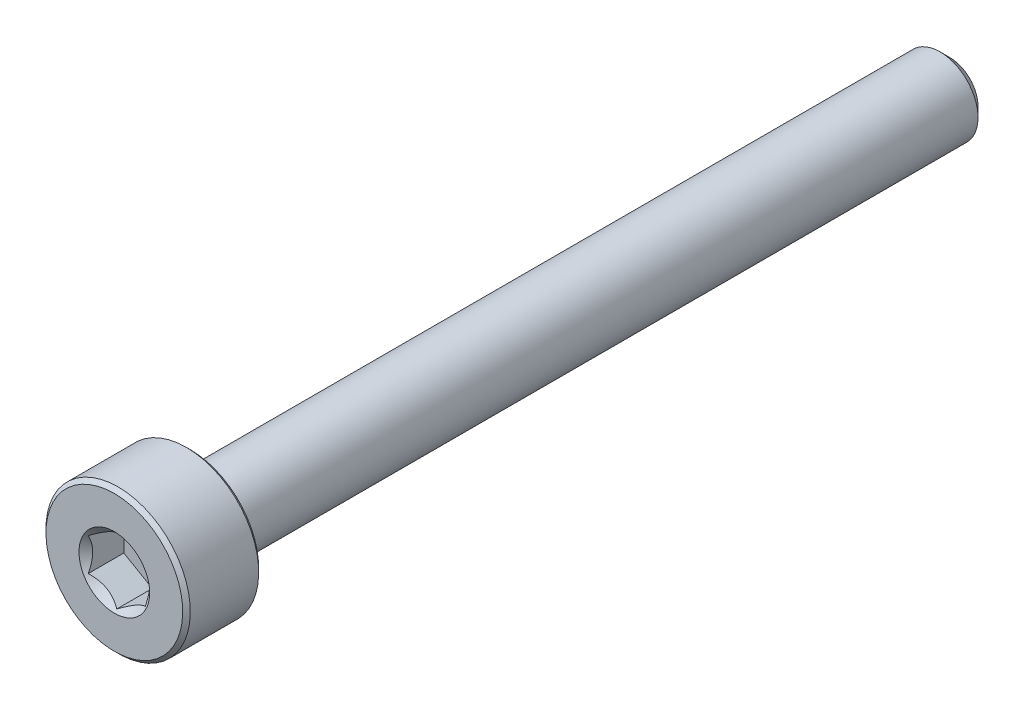
ISO-10303-21;
HEADER;
FILE_DESCRIPTION(('STEP AP214'),'2;1');
FILE_NAME('part.step','',(''),(''),'','','');
FILE_SCHEMA(('AUTOMOTIVE_DESIGN { 1 0 10303 214 1 1 1 1 }'));
ENDSEC;
DATA;
#1=APPLICATION_CONTEXT('core data for automotive mechanical design processes');
#2=APPLICATION_PROTOCOL_DEFINITION('international standard','automotive_design',2000,#1);
#3=PRODUCT_CONTEXT('',#1,'mechanical');
#4=PRODUCT('Part','Part','',(#3));
#5=PRODUCT_RELATED_PRODUCT_CATEGORY('part','',(#4));
#6=PRODUCT_DEFINITION_FORMATION('','',#4);
#7=PRODUCT_DEFINITION_CONTEXT('part definition',#1,'design');
#8=PRODUCT_DEFINITION('design','',#6,#7);
#9=PRODUCT_DEFINITION_SHAPE('','',#8);
#10=(LENGTH_UNIT() NAMED_UNIT(*) SI_UNIT(.MILLI.,.METRE.));
#11=(NAMED_UNIT(*) PLANE_ANGLE_UNIT() SI_UNIT($,.RADIAN.));
#12=(NAMED_UNIT(*) SI_UNIT($,.STERADIAN.) SOLID_ANGLE_UNIT());
#13=UNCERTAINTY_MEASURE_WITH_UNIT(LENGTH_MEASURE(1.E-05),#10,'distance_accuracy_value','');
#14=(GEOMETRIC_REPRESENTATION_CONTEXT(3) GLOBAL_UNCERTAINTY_ASSIGNED_CONTEXT((#13)) GLOBAL_UNIT_ASSIGNED_CONTEXT((#10,
#11,#12)) REPRESENTATION_CONTEXT('',''));
#15=CARTESIAN_POINT('',(0.,0.,0.));
#16=DIRECTION('',(0.,0.,1.));
#17=DIRECTION('',(1.,0.,0.));
#18=AXIS2_PLACEMENT_3D('',#15,#16,#17);
#19=CARTESIAN_POINT('',(0.,0.740192378864668,-11.));
#20=DIRECTION('',(0.,0.,-1.));
#21=DIRECTION('',(0.,1.,0.));
#22=AXIS2_PLACEMENT_3D('',#19,#20,#21);
#23=PLANE('',#22);
#24=CARTESIAN_POINT('',(0.,0.,-11.));
#25=DIRECTION('',(0.,0.,-1.));
#26=DIRECTION('',(0.,1.,0.));
#27=AXIS2_PLACEMENT_3D('',#24,#25,#26);
#28=CIRCLE('',#27,0.740192378864668);
#29=CARTESIAN_POINT('',(0.,0.740192378864668,-11.));
#30=VERTEX_POINT('',#29);
#31=EDGE_CURVE('E59',#30,#30,#28,.T.);
#32=ORIENTED_EDGE('',*,*,#31,.T.);
#33=EDGE_LOOP('',(#32));
#34=FACE_BOUND('',#33,.T.);
#35=ADVANCED_FACE('F45',(#34),#23,.T.);
#36=CARTESIAN_POINT('',(0.,0.,-11.));
#37=DIRECTION('',(0.,0.,1.));
#38=DIRECTION('',(0.,-1.,0.));
#39=AXIS2_PLACEMENT_3D('',#36,#37,#38);
#40=CONICAL_SURFACE('',#39,0.740192378864668,0.785398163397445);
#41=CARTESIAN_POINT('',(0.,0.,-10.7401923788647));
#42=DIRECTION('',(0.,0.,-1.));
#43=DIRECTION('',(0.,1.,0.));
#44=AXIS2_PLACEMENT_3D('',#41,#42,#43);
#45=CIRCLE('',#44,1.);
#46=CARTESIAN_POINT('',(0.,1.,-10.7401923788647));
#47=VERTEX_POINT('',#46);
#48=EDGE_CURVE('E177',#47,#47,#45,.T.);
#49=ORIENTED_EDGE('',*,*,#48,.T.);
#50=EDGE_LOOP('',(#49));
#51=FACE_BOUND('',#50,.T.);
#52=ORIENTED_EDGE('',*,*,#31,.F.);
#53=EDGE_LOOP('',(#52));
#54=FACE_BOUND('',#53,.T.);
#55=ADVANCED_FACE('F185',(#51,#54),#40,.T.);
#56=CARTESIAN_POINT('',(0.,0.,-11.));
#57=DIRECTION('',(0.,0.,-1.));
#58=DIRECTION('',(0.,1.,0.));
#59=AXIS2_PLACEMENT_3D('',#56,#57,#58);
#60=CYLINDRICAL_SURFACE('',#59,1.);
#61=CARTESIAN_POINT('',(0.,0.,8.9));
#62=DIRECTION('',(0.,0.,-1.));
#63=DIRECTION('',(0.,1.,0.));
#64=AXIS2_PLACEMENT_3D('',#61,#62,#63);
#65=CIRCLE('',#64,1.);
#66=CARTESIAN_POINT('',(0.,1.,8.9));
#67=VERTEX_POINT('',#66);
#68=EDGE_CURVE('E173',#67,#67,#65,.T.);
#69=ORIENTED_EDGE('',*,*,#68,.T.);
#70=EDGE_LOOP('',(#69));
#71=FACE_BOUND('',#70,.T.);
#72=ORIENTED_EDGE('',*,*,#48,.F.);
#73=EDGE_LOOP('',(#72));
#74=FACE_BOUND('',#73,.T.);
#75=ADVANCED_FACE('F187',(#71,#74),#60,.T.);
#76=CARTESIAN_POINT('',(0.,0.,8.9));
#77=DIRECTION('',(0.,0.,-1.));
#78=DIRECTION('',(0.,1.,0.));
#79=AXIS2_PLACEMENT_3D('',#76,#77,#78);
#80=TOROIDAL_SURFACE('',#79,1.1,0.0999999999999989);
#81=CARTESIAN_POINT('',(0.,0.,9.));
#82=DIRECTION('',(0.,0.,-1.));
#83=DIRECTION('',(0.,1.,0.));
#84=AXIS2_PLACEMENT_3D('',#81,#82,#83);
#85=CIRCLE('',#84,1.1);
#86=CARTESIAN_POINT('',(0.,1.1,9.));
#87=VERTEX_POINT('',#86);
#88=EDGE_CURVE('E169',#87,#87,#85,.T.);
#89=ORIENTED_EDGE('',*,*,#88,.T.);
#90=EDGE_LOOP('',(#89));
#91=FACE_BOUND('',#90,.T.);
#92=ORIENTED_EDGE('',*,*,#68,.F.);
#93=EDGE_LOOP('',(#92));
#94=FACE_BOUND('',#93,.T.);
#95=ADVANCED_FACE('F194',(#91,#94),#80,.F.);
#96=CARTESIAN_POINT('',(0.,1.8,9.));
#97=DIRECTION('',(0.,0.,-1.));
#98=DIRECTION('',(0.,1.,0.));
#99=AXIS2_PLACEMENT_3D('',#96,#97,#98);
#100=PLANE('',#99);
#101=CARTESIAN_POINT('',(0.,0.,9.));
#102=DIRECTION('',(0.,0.,-1.));
#103=DIRECTION('',(0.,1.,0.));
#104=AXIS2_PLACEMENT_3D('',#101,#102,#103);
#105=CIRCLE('',#104,1.8);
#106=CARTESIAN_POINT('',(0.,1.8,9.));
#107=VERTEX_POINT('',#106);
#108=EDGE_CURVE('E165',#107,#107,#105,.T.);
#109=ORIENTED_EDGE('',*,*,#108,.T.);
#110=EDGE_LOOP('',(#109));
#111=FACE_BOUND('',#110,.T.);
#112=ORIENTED_EDGE('',*,*,#88,.F.);
#113=EDGE_LOOP('',(#112));
#114=FACE_BOUND('',#113,.T.);
#115=ADVANCED_FACE('F200',(#111,#114),#100,.T.);
#116=CARTESIAN_POINT('',(0.,0.,9.));
#117=DIRECTION('',(0.,0.,1.));
#118=DIRECTION('',(0.,-1.,0.));
#119=AXIS2_PLACEMENT_3D('',#116,#117,#118);
#120=CONICAL_SURFACE('',#119,1.8,0.785398163397469);
#121=CARTESIAN_POINT('',(0.,0.,9.1));
#122=DIRECTION('',(0.,0.,-1.));
#123=DIRECTION('',(0.,1.,0.));
#124=AXIS2_PLACEMENT_3D('',#121,#122,#123);
#125=CIRCLE('',#124,1.9);
#126=CARTESIAN_POINT('',(0.,1.9,9.1));
#127=VERTEX_POINT('',#126);
#128=EDGE_CURVE('E161',#127,#127,#125,.T.);
#129=ORIENTED_EDGE('',*,*,#128,.T.);
#130=EDGE_LOOP('',(#129));
#131=FACE_BOUND('',#130,.T.);
#132=ORIENTED_EDGE('',*,*,#108,.F.);
#133=EDGE_LOOP('',(#132));
#134=FACE_BOUND('',#133,.T.);
#135=ADVANCED_FACE('F204',(#131,#134),#120,.T.);
#136=CARTESIAN_POINT('',(0.,0.,-11.));
#137=DIRECTION('',(0.,0.,-1.));
#138=DIRECTION('',(0.,1.,0.));
#139=AXIS2_PLACEMENT_3D('',#136,#137,#138);
#140=CYLINDRICAL_SURFACE('',#139,1.9);
#141=CARTESIAN_POINT('',(0.,0.,10.9));
#142=DIRECTION('',(0.,0.,-1.));
#143=DIRECTION('',(0.,1.,0.));
#144=AXIS2_PLACEMENT_3D('',#141,#142,#143);
#145=CIRCLE('',#144,1.9);
#146=CARTESIAN_POINT('',(0.,1.9,10.9));
#147=VERTEX_POINT('',#146);
#148=EDGE_CURVE('E157',#147,#147,#145,.T.);
#149=ORIENTED_EDGE('',*,*,#148,.T.);
#150=EDGE_LOOP('',(#149));
#151=FACE_BOUND('',#150,.T.);
#152=ORIENTED_EDGE('',*,*,#128,.F.);
#153=EDGE_LOOP('',(#152));
#154=FACE_BOUND('',#153,.T.);
#155=ADVANCED_FACE('F208',(#151,#154),#140,.T.);
#156=CARTESIAN_POINT('',(0.,0.,10.9));
#157=DIRECTION('',(0.,0.,-1.));
#158=DIRECTION('',(0.,1.,0.));
#159=AXIS2_PLACEMENT_3D('',#156,#157,#158);
#160=CONICAL_SURFACE('',#159,1.9,0.785398163397452);
#161=CARTESIAN_POINT('',(0.,0.,11.));
#162=DIRECTION('',(0.,0.,-1.));
#163=DIRECTION('',(0.,1.,0.));
#164=AXIS2_PLACEMENT_3D('',#161,#162,#163);
#165=CIRCLE('',#164,1.8);
#166=CARTESIAN_POINT('',(0.,1.8,11.));
#167=VERTEX_POINT('',#166);
#168=EDGE_CURVE('E153',#167,#167,#165,.T.);
#169=ORIENTED_EDGE('',*,*,#168,.T.);
#170=EDGE_LOOP('',(#169));
#171=FACE_BOUND('',#170,.T.);
#172=ORIENTED_EDGE('',*,*,#148,.F.);
#173=EDGE_LOOP('',(#172));
#174=FACE_BOUND('',#173,.T.);
#175=ADVANCED_FACE('F212',(#171,#174),#160,.T.);
#176=CARTESIAN_POINT('',(0.,0.,11.));
#177=DIRECTION('',(0.,0.,1.));
#178=DIRECTION('',(0.,-1.,0.));
#179=AXIS2_PLACEMENT_3D('',#176,#177,#178);
#180=PLANE('',#179);
#181=CARTESIAN_POINT('',(0.,0.,11.));
#182=DIRECTION('',(0.,0.,1.));
#183=DIRECTION('',(1.,0.,0.));
#184=AXIS2_PLACEMENT_3D('',#181,#182,#183);
#185=CIRCLE('',#184,0.930977309068267);
#186=CARTESIAN_POINT('',(0.930977309068267,0.,11.));
#187=VERTEX_POINT('',#186);
#188=EDGE_CURVE('E119',#187,#187,#185,.T.);
#189=ORIENTED_EDGE('',*,*,#188,.F.);
#190=EDGE_LOOP('',(#189));
#191=FACE_BOUND('',#190,.T.);
#192=ORIENTED_EDGE('',*,*,#168,.F.);
#193=EDGE_LOOP('',(#192));
#194=FACE_BOUND('',#193,.T.);
#195=ADVANCED_FACE('F216',(#191,#194),#180,.T.);
#196=CARTESIAN_POINT('',(0.,0.,11.));
#197=DIRECTION('',(0.,0.,1.));
#198=DIRECTION('',(1.,0.,0.));
#199=AXIS2_PLACEMENT_3D('',#196,#197,#198);
#200=CONICAL_SURFACE('',#199,0.930977309068267,0.78539816339745);
#201=ORIENTED_EDGE('',*,*,#188,.T.);
#202=EDGE_LOOP('',(#201));
#203=FACE_BOUND('',#202,.T.);
#204=CARTESIAN_POINT('',(-0.000200000000000882,-0.86614087383827,10.9351635878609));
#205=CARTESIAN_POINT('',(0.0255899625576803,-0.851251032013203,10.9202822051801));
#206=CARTESIAN_POINT('',(0.0518112021286577,-0.836112192288413,10.9062743603231));
#207=CARTESIAN_POINT('',(0.105279708235704,-0.805242135894343,10.8806256193984));
#208=CARTESIAN_POINT('',(0.132532067460571,-0.789507978959814,10.8689990064218));
#209=CARTESIAN_POINT('',(0.18748535038135,-0.757780686272648,10.8490821404884));
#210=CARTESIAN_POINT('',(0.215172256695506,-0.741795643459142,10.8407417887975));
#211=CARTESIAN_POINT('',(0.271155595130849,-0.709473647943363,10.8278908366776));
#212=CARTESIAN_POINT('',(0.299450314843641,-0.693137683900538,10.823370635305));
#213=CARTESIAN_POINT('',(0.348210289268839,-0.66498609954047,10.8192939278136));
#214=CARTESIAN_POINT('',(0.368612065655568,-0.653207128451646,10.8186908913302));
#215=CARTESIAN_POINT('',(0.409376134696355,-0.629671982217683,10.8197026007317));
#216=CARTESIAN_POINT('',(0.42973841765145,-0.617915812672244,10.8213178357062));
#217=CARTESIAN_POINT('',(0.490534543086818,-0.582815153286448,10.8293842416892));
#218=CARTESIAN_POINT('',(0.530665854996093,-0.559645329552695,10.8390570305439));
#219=CARTESIAN_POINT('',(0.601110400354021,-0.518974152327354,10.8624044126885));
#220=CARTESIAN_POINT('',(0.631753572009083,-0.501282308923481,10.8748566527884));
#221=CARTESIAN_POINT('',(0.691839345804788,-0.466591771248063,10.902907704947));
#222=CARTESIAN_POINT('',(0.72128548838159,-0.44959103290475,10.9184962806199));
#223=CARTESIAN_POINT('',(0.7502,-0.432897231838375,10.9351635878609));
#224=B_SPLINE_CURVE_WITH_KNOTS('',3,(#204,#205,#206,#207,#208,#209,#210,#211,#212,#213,#214,
#215,#216,#217,#218,#219,#220,#221,#222,#223),.UNSPECIFIED.,.F.,.F.,(4,2,2,2,2,2,2,2,2,4),(0.,
0.0999419466095583,0.200466857654444,0.299393763705714,0.398071297300226,0.468665775681743,
0.539275821398833,0.68053625724456,0.792918418368072,0.904939568716033),.UNSPECIFIED.);
#225=CARTESIAN_POINT('',(0.,-0.866025403784432,10.9350480947162));
#226=VERTEX_POINT('',#225);
#227=CARTESIAN_POINT('',(0.75,-0.433012701892213,10.9350480947162));
#228=VERTEX_POINT('',#227);
#229=EDGE_CURVE('E12',#226,#228,#224,.T.);
#230=ORIENTED_EDGE('',*,*,#229,.F.);
#231=CARTESIAN_POINT('',(-0.750199999999995,-0.43289723183838,10.9351635878609));
#232=CARTESIAN_POINT('',(-0.724410037442314,-0.447787073663448,10.9202822051801));
#233=CARTESIAN_POINT('',(-0.698188797871337,-0.462925913388237,10.9062743603231));
#234=CARTESIAN_POINT('',(-0.64472029176429,-0.493795969782307,10.8806256193984));
#235=CARTESIAN_POINT('',(-0.617467932539424,-0.509530126716836,10.8689990064218));
#236=CARTESIAN_POINT('',(-0.562514649618644,-0.541257419404002,10.8490821404884));
#237=CARTESIAN_POINT('',(-0.534827743304487,-0.557242462217508,10.8407417887975));
#238=CARTESIAN_POINT('',(-0.478844404869144,-0.589564457733288,10.8278908366776));
#239=CARTESIAN_POINT('',(-0.450549685156352,-0.605900421776113,10.823370635305));
#240=CARTESIAN_POINT('',(-0.401789710731154,-0.63405200613618,10.8192939278136));
#241=CARTESIAN_POINT('',(-0.381387934344425,-0.645830977225005,10.8186908913302));
#242=CARTESIAN_POINT('',(-0.340623865303637,-0.669366123458968,10.8197026007317));
#243=CARTESIAN_POINT('',(-0.320261582348542,-0.681122293004407,10.8213178357062));
#244=CARTESIAN_POINT('',(-0.259465456913174,-0.716222952390203,10.8293842416892));
#245=CARTESIAN_POINT('',(-0.219334145003899,-0.739392776123956,10.8390570305439));
#246=CARTESIAN_POINT('',(-0.148889599645973,-0.780063953349295,10.8624044126885));
#247=CARTESIAN_POINT('',(-0.118246427990913,-0.797755796753168,10.8748566527884));
#248=CARTESIAN_POINT('',(-0.0581606541952109,-0.832446334428583,10.902907704947));
#249=CARTESIAN_POINT('',(-0.0287145116184102,-0.849447072771895,10.9184962806199));
#250=CARTESIAN_POINT('',(0.00019999999999879,-0.86614087383827,10.9351635878609));
#251=B_SPLINE_CURVE_WITH_KNOTS('',3,(#231,#232,#233,#234,#235,#236,#237,#238,#239,#240,#241,
#242,#243,#244,#245,#246,#247,#248,#249,#250),.UNSPECIFIED.,.F.,.F.,(4,2,2,2,2,2,2,2,2,4),(0.,
0.0999419466095584,0.200466857654444,0.299393763705715,0.398071297300228,0.468665775681745,
0.539275821398836,0.680536257244562,0.792918418368067,0.904939568716024),.UNSPECIFIED.);
#252=CARTESIAN_POINT('',(-0.749999999999995,-0.433012701892218,10.9350480947162));
#253=VERTEX_POINT('',#252);
#254=EDGE_CURVE('E104',#253,#226,#251,.T.);
#255=ORIENTED_EDGE('',*,*,#254,.F.);
#256=CARTESIAN_POINT('',(-0.749999999999995,-0.908993158424502,11.2474829414547));
#257=CARTESIAN_POINT('',(-0.749999999999995,-0.887052399965033,11.2305616523291));
#258=CARTESIAN_POINT('',(-0.749999999999995,-0.86499445254444,11.2137927714218));
#259=CARTESIAN_POINT('',(-0.749999999999995,-0.820595091161565,11.180624057915));
#260=CARTESIAN_POINT('',(-0.749999999999995,-0.798253612413866,11.1642243121246));
#261=CARTESIAN_POINT('',(-0.749999999999995,-0.730403515944951,11.1154409498094));
#262=CARTESIAN_POINT('',(-0.749999999999995,-0.68440148609021,11.0837326305615));
#263=CARTESIAN_POINT('',(-0.749999999999995,-0.587630943752086,11.0210512707378));
#264=CARTESIAN_POINT('',(-0.749999999999995,-0.536746006676904,10.9902560400654));
#265=CARTESIAN_POINT('',(-0.749999999999995,-0.432383376454022,10.9336257718331));
#266=CARTESIAN_POINT('',(-0.749999999999995,-0.378915238071278,10.9077739815374));
#267=CARTESIAN_POINT('',(-0.749999999999996,-0.299071429351744,10.876137143555));
#268=CARTESIAN_POINT('',(-0.749999999999996,-0.273980510808171,10.8671385892067));
#269=CARTESIAN_POINT('',(-0.749999999999996,-0.223167896807673,10.8511461852722));
#270=CARTESIAN_POINT('',(-0.749999999999996,-0.197446161667869,10.8441524621572));
#271=CARTESIAN_POINT('',(-0.749999999999996,-0.120459338268895,10.8270275033935));
#272=CARTESIAN_POINT('',(-0.749999999999996,-0.0683464355179097,10.8203161345352));
#273=CARTESIAN_POINT('',(-0.749999999999996,0.0337920589257209,10.8181253211917));
#274=CARTESIAN_POINT('',(-0.749999999999996,0.0838066628456611,10.8221565412005));
#275=CARTESIAN_POINT('',(-0.749999999999996,0.157981834018414,10.835074885811));
#276=CARTESIAN_POINT('',(-0.749999999999996,0.182796003556083,10.8406123005046));
#277=CARTESIAN_POINT('',(-0.749999999999996,0.231887166565739,10.853698524901));
#278=CARTESIAN_POINT('',(-0.749999999999996,0.256164188491815,10.8612472277831));
#279=CARTESIAN_POINT('',(-0.749999999999996,0.330659225549255,10.8873056029569));
#280=CARTESIAN_POINT('',(-0.749999999999996,0.379861121085842,10.9087021269934));
#281=CARTESIAN_POINT('',(-0.749999999999996,0.475970605705221,10.9563197744089));
#282=CARTESIAN_POINT('',(-0.749999999999996,0.522869373813368,10.98255785461));
#283=CARTESIAN_POINT('',(-0.749999999999996,0.612520945812657,11.0367390817918));
#284=CARTESIAN_POINT('',(-0.749999999999996,0.655364174071618,11.0645345354766));
#285=CARTESIAN_POINT('',(-0.749999999999997,0.71848476681328,11.1075252259075));
#286=CARTESIAN_POINT('',(-0.749999999999997,0.739253587078311,11.1220113238788));
#287=CARTESIAN_POINT('',(-0.749999999999997,0.780506229689749,11.1513724151974));
#288=CARTESIAN_POINT('',(-0.749999999999997,0.80099012861976,11.1662473008223));
#289=CARTESIAN_POINT('',(-0.749999999999997,0.821355148585423,11.181283577643));
#290=B_SPLINE_CURVE_WITH_KNOTS('',3,(#256,#257,#258,#259,#260,#261,#262,#263,#264,#265,#266,
#267,#268,#269,#270,#271,#272,#273,#274,#275,#276,#277,#278,#279,#280,#281,#282,#283,#284,#285,
#286,#287,#288,#289),.UNSPECIFIED.,.F.,.F.,(4,2,2,2,2,2,2,2,2,2,2,2,2,2,2,2,4),(0.,
0.0831217081502311,0.166262763947899,0.333808791437732,0.512108301465774,0.689792429955633,
0.769685928014,0.849584464902763,1.00608040173681,1.15557098404965,1.23177009418091,
1.30796515813853,1.46846030983728,1.62952862501053,1.78266144768383,1.85862369010575,
1.93456510404422),.UNSPECIFIED.);
#291=CARTESIAN_POINT('',(-0.749999999999996,0.433012701892216,10.9350480947162));
#292=VERTEX_POINT('',#291);
#293=EDGE_CURVE('E118',#292,#253,#290,.F.);
#294=ORIENTED_EDGE('',*,*,#293,.F.);
#295=CARTESIAN_POINT('',(0.000199999999999783,0.866140873838272,10.9351635878609));
#296=CARTESIAN_POINT('',(-0.0255899625576815,0.851251032013204,10.9202822051801));
#297=CARTESIAN_POINT('',(-0.051811202128659,0.836112192288415,10.9062743603231));
#298=CARTESIAN_POINT('',(-0.105279708235706,0.805242135894344,10.8806256193984));
#299=CARTESIAN_POINT('',(-0.132532067460572,0.789507978959815,10.8689990064218));
#300=CARTESIAN_POINT('',(-0.187485350381352,0.757780686272649,10.8490821404884));
#301=CARTESIAN_POINT('',(-0.215172256695509,0.741795643459143,10.8407417887975));
#302=CARTESIAN_POINT('',(-0.271155595130852,0.709473647943363,10.8278908366776));
#303=CARTESIAN_POINT('',(-0.299450314843644,0.693137683900538,10.823370635305));
#304=CARTESIAN_POINT('',(-0.348210289268843,0.66498609954047,10.8192939278136));
#305=CARTESIAN_POINT('',(-0.368612065655572,0.653207128451646,10.8186908913302));
#306=CARTESIAN_POINT('',(-0.409376134696359,0.629671982217683,10.8197026007317));
#307=CARTESIAN_POINT('',(-0.429738417651454,0.617915812672243,10.8213178357062));
#308=CARTESIAN_POINT('',(-0.490534543086823,0.582815153286447,10.8293842416892));
#309=CARTESIAN_POINT('',(-0.530665854996098,0.559645329552694,10.8390570305439));
#310=CARTESIAN_POINT('',(-0.601110400354024,0.518974152327355,10.8624044126885));
#311=CARTESIAN_POINT('',(-0.631753572009084,0.501282308923482,10.8748566527884));
#312=CARTESIAN_POINT('',(-0.691839345804786,0.466591771248066,10.902907704947));
#313=CARTESIAN_POINT('',(-0.721285488381587,0.449591032904754,10.9184962806199));
#314=CARTESIAN_POINT('',(-0.750199999999996,0.432897231838379,10.9351635878609));
#315=B_SPLINE_CURVE_WITH_KNOTS('',3,(#295,#296,#297,#298,#299,#300,#301,#302,#303,#304,#305,
#306,#307,#308,#309,#310,#311,#312,#313,#314),.UNSPECIFIED.,.F.,.F.,(4,2,2,2,2,2,2,2,2,4),(0.,
0.0999419466095586,0.200466857654445,0.299393763705716,0.398071297300229,0.468665775681746,
0.539275821398838,0.680536257244564,0.79291841836807,0.904939568716026),.UNSPECIFIED.);
#316=CARTESIAN_POINT('',(0.,0.866025403784434,10.9350480947162));
#317=VERTEX_POINT('',#316);
#318=EDGE_CURVE('E267',#317,#292,#315,.T.);
#319=ORIENTED_EDGE('',*,*,#318,.F.);
#320=CARTESIAN_POINT('',(0.7502,0.432897231838378,10.9351635878609));
#321=CARTESIAN_POINT('',(0.724410037442319,0.447787073663446,10.9202822051801));
#322=CARTESIAN_POINT('',(0.698188797871341,0.462925913388236,10.9062743603231));
#323=CARTESIAN_POINT('',(0.644720291764293,0.493795969782307,10.8806256193984));
#324=CARTESIAN_POINT('',(0.617467932539426,0.509530126716836,10.8689990064218));
#325=CARTESIAN_POINT('',(0.562514649618645,0.541257419404003,10.8490821404884));
#326=CARTESIAN_POINT('',(0.534827743304488,0.557242462217509,10.8407417887975));
#327=CARTESIAN_POINT('',(0.478844404869144,0.589564457733289,10.8278908366776));
#328=CARTESIAN_POINT('',(0.450549685156352,0.605900421776114,10.823370635305));
#329=CARTESIAN_POINT('',(0.401789710731153,0.634052006136182,10.8192939278136));
#330=CARTESIAN_POINT('',(0.381387934344424,0.645830977225006,10.8186908913302));
#331=CARTESIAN_POINT('',(0.340623865303637,0.669366123458969,10.8197026007317));
#332=CARTESIAN_POINT('',(0.320261582348542,0.681122293004409,10.8213178357062));
#333=CARTESIAN_POINT('',(0.259465456913173,0.716222952390205,10.8293842416892));
#334=CARTESIAN_POINT('',(0.219334145003898,0.739392776123958,10.8390570305439));
#335=CARTESIAN_POINT('',(0.148889599645972,0.780063953349297,10.8624044126885));
#336=CARTESIAN_POINT('',(0.118246427990912,0.79775579675317,10.8748566527884));
#337=CARTESIAN_POINT('',(0.0581606541952094,0.832446334428585,10.902907704947));
#338=CARTESIAN_POINT('',(0.028714511618409,0.849447072771897,10.9184962806199));
#339=CARTESIAN_POINT('',(-0.000199999999999814,0.866140873838272,10.9351635878609));
#340=B_SPLINE_CURVE_WITH_KNOTS('',3,(#320,#321,#322,#323,#324,#325,#326,#327,#328,#329,#330,
#331,#332,#333,#334,#335,#336,#337,#338,#339),.UNSPECIFIED.,.F.,.F.,(4,2,2,2,2,2,2,2,2,4),(0.,
0.0999419466095605,0.200466857654449,0.299393763705721,0.398071297300234,0.468665775681752,
0.539275821398843,0.68053625724457,0.792918418368076,0.904939568716031),.UNSPECIFIED.);
#341=CARTESIAN_POINT('',(0.75,0.433012701892216,10.9350480947162));
#342=VERTEX_POINT('',#341);
#343=EDGE_CURVE('E240',#342,#317,#340,.T.);
#344=ORIENTED_EDGE('',*,*,#343,.F.);
#345=CARTESIAN_POINT('',(0.75,-0.90899315842449,11.2474829414546));
#346=CARTESIAN_POINT('',(0.75,-0.887052399965021,11.2305616523291));
#347=CARTESIAN_POINT('',(0.75,-0.864994452544429,11.2137927714218));
#348=CARTESIAN_POINT('',(0.75,-0.820595091161554,11.180624057915));
#349=CARTESIAN_POINT('',(0.75,-0.798253612413854,11.1642243121246));
#350=CARTESIAN_POINT('',(0.75,-0.73040351594494,11.1154409498094));
#351=CARTESIAN_POINT('',(0.75,-0.6844014860902,11.0837326305615));
#352=CARTESIAN_POINT('',(0.75,-0.587630943752076,11.0210512707378));
#353=CARTESIAN_POINT('',(0.75,-0.536746006676895,10.9902560400654));
#354=CARTESIAN_POINT('',(0.75,-0.432383376454014,10.9336257718331));
#355=CARTESIAN_POINT('',(0.75,-0.378915238071271,10.9077739815374));
#356=CARTESIAN_POINT('',(0.75,-0.299071429351738,10.876137143555));
#357=CARTESIAN_POINT('',(0.75,-0.273980510808165,10.8671385892067));
#358=CARTESIAN_POINT('',(0.75,-0.223167896807668,10.8511461852722));
#359=CARTESIAN_POINT('',(0.75,-0.197446161667864,10.8441524621572));
#360=CARTESIAN_POINT('',(0.75,-0.120459338268891,10.8270275033935));
#361=CARTESIAN_POINT('',(0.75,-0.0683464355179048,10.8203161345352));
#362=CARTESIAN_POINT('',(0.75,0.0337920589257254,10.8181253211917));
#363=CARTESIAN_POINT('',(0.75,0.0838066628456652,10.8221565412005));
#364=CARTESIAN_POINT('',(0.75,0.157981834018418,10.835074885811));
#365=CARTESIAN_POINT('',(0.75,0.182796003556087,10.8406123005046));
#366=CARTESIAN_POINT('',(0.75,0.231887166565743,10.853698524901));
#367=CARTESIAN_POINT('',(0.75,0.256164188491818,10.8612472277831));
#368=CARTESIAN_POINT('',(0.75,0.330659225549259,10.8873056029569));
#369=CARTESIAN_POINT('',(0.75,0.379861121085847,10.9087021269934));
#370=CARTESIAN_POINT('',(0.75,0.475970605705227,10.9563197744089));
#371=CARTESIAN_POINT('',(0.75,0.522869373813375,10.98255785461));
#372=CARTESIAN_POINT('',(0.75,0.612520945812665,11.0367390817918));
#373=CARTESIAN_POINT('',(0.75,0.655364174071626,11.0645345354766));
#374=CARTESIAN_POINT('',(0.75,0.718484766813289,11.1075252259075));
#375=CARTESIAN_POINT('',(0.75,0.739253587078319,11.1220113238788));
#376=CARTESIAN_POINT('',(0.75,0.780506229689757,11.1513724151974));
#377=CARTESIAN_POINT('',(0.75,0.800990128619768,11.1662473008223));
#378=CARTESIAN_POINT('',(0.75,0.821355148585432,11.181283577643));
#379=B_SPLINE_CURVE_WITH_KNOTS('',3,(#345,#346,#347,#348,#349,#350,#351,#352,#353,#354,#355,
#356,#357,#358,#359,#360,#361,#362,#363,#364,#365,#366,#367,#368,#369,#370,#371,#372,#373,#374,
#375,#376,#377,#378),.UNSPECIFIED.,.F.,.F.,(4,2,2,2,2,2,2,2,2,2,2,2,2,2,2,2,4),(0.,
0.0831217081502309,0.166262763947899,0.33380879143773,0.51210830146577,0.689792429955624,
0.769685928013991,0.849584464902753,1.0060804017368,1.15557098404963,1.2317700941809,
1.30796515813852,1.46846030983727,1.62952862501053,1.78266144768382,1.85862369010574,
1.93456510404421),.UNSPECIFIED.);
#380=EDGE_CURVE('E66',#228,#342,#379,.T.);
#381=ORIENTED_EDGE('',*,*,#380,.F.);
#382=EDGE_LOOP('',(#230,#255,#294,#319,#344,#381));
#383=FACE_BOUND('',#382,.T.);
#384=ADVANCED_FACE('F103',(#203,#383),#200,.F.);
#385=CARTESIAN_POINT('',(0.,1.8,10.));
#386=DIRECTION('',(0.,0.,-1.));
#387=DIRECTION('',(0.,1.,0.));
#388=AXIS2_PLACEMENT_3D('',#385,#386,#387);
#389=PLANE('',#388);
#390=DIRECTION('',(0.866025403784439,0.5,0.));
#391=VECTOR('',#390,1.);
#392=CARTESIAN_POINT('',(0.,-0.866025403784432,10.));
#393=LINE('',#392,#391);
#394=CARTESIAN_POINT('',(0.,-0.866025403784432,10.));
#395=VERTEX_POINT('',#394);
#396=CARTESIAN_POINT('',(0.75,-0.433012701892213,10.));
#397=VERTEX_POINT('',#396);
#398=EDGE_CURVE('E122',#395,#397,#393,.T.);
#399=ORIENTED_EDGE('',*,*,#398,.T.);
#400=DIRECTION('',(0.,1.,0.));
#401=VECTOR('',#400,1.);
#402=CARTESIAN_POINT('',(0.75,-0.433012701892213,10.));
#403=LINE('',#402,#401);
#404=CARTESIAN_POINT('',(0.75,0.433012701892216,10.));
#405=VERTEX_POINT('',#404);
#406=EDGE_CURVE('E73',#397,#405,#403,.T.);
#407=ORIENTED_EDGE('',*,*,#406,.T.);
#408=DIRECTION('',(-0.866025403784439,0.499999999999999,0.));
#409=VECTOR('',#408,1.);
#410=CARTESIAN_POINT('',(0.75,0.433012701892216,10.));
#411=LINE('',#410,#409);
#412=CARTESIAN_POINT('',(0.,0.866025403784434,10.));
#413=VERTEX_POINT('',#412);
#414=EDGE_CURVE('E133',#405,#413,#411,.T.);
#415=ORIENTED_EDGE('',*,*,#414,.T.);
#416=DIRECTION('',(-0.866025403784438,-0.5,0.));
#417=VECTOR('',#416,1.);
#418=CARTESIAN_POINT('',(0.,0.866025403784434,10.));
#419=LINE('',#418,#417);
#420=CARTESIAN_POINT('',(-0.749999999999996,0.433012701892217,10.));
#421=VERTEX_POINT('',#420);
#422=EDGE_CURVE('E142',#413,#421,#419,.T.);
#423=ORIENTED_EDGE('',*,*,#422,.T.);
#424=DIRECTION('',(0.,-1.,0.));
#425=VECTOR('',#424,1.);
#426=CARTESIAN_POINT('',(-0.749999999999996,0.433012701892217,10.));
#427=LINE('',#426,#425);
#428=CARTESIAN_POINT('',(-0.749999999999995,-0.433012701892218,10.));
#429=VERTEX_POINT('',#428);
#430=EDGE_CURVE('E137',#421,#429,#427,.T.);
#431=ORIENTED_EDGE('',*,*,#430,.T.);
#432=DIRECTION('',(0.866025403784439,-0.499999999999999,0.));
#433=VECTOR('',#432,1.);
#434=CARTESIAN_POINT('',(-0.749999999999995,-0.433012701892218,10.));
#435=LINE('',#434,#433);
#436=EDGE_CURVE('E124',#429,#395,#435,.T.);
#437=ORIENTED_EDGE('',*,*,#436,.T.);
#438=EDGE_LOOP('',(#399,#407,#415,#423,#431,#437));
#439=FACE_BOUND('',#438,.T.);
#440=ADVANCED_FACE('F221',(#439),#389,.F.);
#441=CARTESIAN_POINT('',(0.,-0.866025403784432,6.70871215252209));
#442=DIRECTION('',(0.5,-0.866025403784439,0.));
#443=DIRECTION('',(0.866025403784439,0.5,0.));
#444=AXIS2_PLACEMENT_3D('',#441,#442,#443);
#445=PLANE('',#444);
#446=DIRECTION('',(0.,0.,1.));
#447=VECTOR('',#446,1.);
#448=CARTESIAN_POINT('',(0.,-0.866025403784432,6.70871215252209));
#449=LINE('',#448,#447);
#450=EDGE_CURVE('E113',#395,#226,#449,.T.);
#451=ORIENTED_EDGE('',*,*,#450,.T.);
#452=ORIENTED_EDGE('',*,*,#229,.T.);
#453=DIRECTION('',(0.,0.,1.));
#454=VECTOR('',#453,1.);
#455=CARTESIAN_POINT('',(0.75,-0.433012701892213,6.70871215252209));
#456=LINE('',#455,#454);
#457=EDGE_CURVE('E128',#397,#228,#456,.T.);
#458=ORIENTED_EDGE('',*,*,#457,.F.);
#459=ORIENTED_EDGE('',*,*,#398,.F.);
#460=EDGE_LOOP('',(#451,#452,#458,#459));
#461=FACE_BOUND('',#460,.T.);
#462=ADVANCED_FACE('F121',(#461),#445,.F.);
#463=CARTESIAN_POINT('',(-0.749999999999995,-0.433012701892218,6.70871215252209));
#464=DIRECTION('',(-0.499999999999999,-0.866025403784439,0.));
#465=DIRECTION('',(0.866025403784439,-0.499999999999999,0.));
#466=AXIS2_PLACEMENT_3D('',#463,#464,#465);
#467=PLANE('',#466);
#468=DIRECTION('',(0.,0.,1.));
#469=VECTOR('',#468,1.);
#470=CARTESIAN_POINT('',(-0.749999999999995,-0.433012701892218,6.70871215252209));
#471=LINE('',#470,#469);
#472=EDGE_CURVE('E116',#429,#253,#471,.T.);
#473=ORIENTED_EDGE('',*,*,#472,.T.);
#474=ORIENTED_EDGE('',*,*,#254,.T.);
#475=ORIENTED_EDGE('',*,*,#450,.F.);
#476=ORIENTED_EDGE('',*,*,#436,.F.);
#477=EDGE_LOOP('',(#473,#474,#475,#476));
#478=FACE_BOUND('',#477,.T.);
#479=ADVANCED_FACE('F112',(#478),#467,.F.);
#480=CARTESIAN_POINT('',(-0.749999999999996,0.433012701892217,6.70871215252209));
#481=DIRECTION('',(-1.,0.,0.));
#482=DIRECTION('',(0.,-1.,0.));
#483=AXIS2_PLACEMENT_3D('',#480,#481,#482);
#484=PLANE('',#483);
#485=DIRECTION('',(0.,0.,1.));
#486=VECTOR('',#485,1.);
#487=CARTESIAN_POINT('',(-0.749999999999996,0.433012701892217,6.70871215252209));
#488=LINE('',#487,#486);
#489=EDGE_CURVE('E138',#421,#292,#488,.T.);
#490=ORIENTED_EDGE('',*,*,#489,.T.);
#491=ORIENTED_EDGE('',*,*,#293,.T.);
#492=ORIENTED_EDGE('',*,*,#472,.F.);
#493=ORIENTED_EDGE('',*,*,#430,.F.);
#494=EDGE_LOOP('',(#490,#491,#492,#493));
#495=FACE_BOUND('',#494,.T.);
#496=ADVANCED_FACE('F277',(#495),#484,.F.);
#497=CARTESIAN_POINT('',(0.,0.866025403784434,6.70871215252209));
#498=DIRECTION('',(-0.5,0.866025403784438,0.));
#499=DIRECTION('',(-0.866025403784438,-0.5,0.));
#500=AXIS2_PLACEMENT_3D('',#497,#498,#499);
#501=PLANE('',#500);
#502=DIRECTION('',(0.,0.,1.));
#503=VECTOR('',#502,1.);
#504=CARTESIAN_POINT('',(0.,0.866025403784434,6.70871215252209));
#505=LINE('',#504,#503);
#506=EDGE_CURVE('E143',#413,#317,#505,.T.);
#507=ORIENTED_EDGE('',*,*,#506,.T.);
#508=ORIENTED_EDGE('',*,*,#318,.T.);
#509=ORIENTED_EDGE('',*,*,#489,.F.);
#510=ORIENTED_EDGE('',*,*,#422,.F.);
#511=EDGE_LOOP('',(#507,#508,#509,#510));
#512=FACE_BOUND('',#511,.T.);
#513=ADVANCED_FACE('F274',(#512),#501,.F.);
#514=CARTESIAN_POINT('',(0.75,0.433012701892216,6.70871215252209));
#515=DIRECTION('',(0.499999999999999,0.866025403784439,0.));
#516=DIRECTION('',(-0.866025403784439,0.499999999999999,0.));
#517=AXIS2_PLACEMENT_3D('',#514,#515,#516);
#518=PLANE('',#517);
#519=DIRECTION('',(0.,0.,1.));
#520=VECTOR('',#519,1.);
#521=CARTESIAN_POINT('',(0.75,0.433012701892216,6.70871215252209));
#522=LINE('',#521,#520);
#523=EDGE_CURVE('E147',#405,#342,#522,.T.);
#524=ORIENTED_EDGE('',*,*,#523,.T.);
#525=ORIENTED_EDGE('',*,*,#343,.T.);
#526=ORIENTED_EDGE('',*,*,#506,.F.);
#527=ORIENTED_EDGE('',*,*,#414,.F.);
#528=EDGE_LOOP('',(#524,#525,#526,#527));
#529=FACE_BOUND('',#528,.T.);
#530=ADVANCED_FACE('F229',(#529),#518,.F.);
#531=CARTESIAN_POINT('',(0.75,-0.433012701892213,6.70871215252209));
#532=DIRECTION('',(1.,0.,0.));
#533=DIRECTION('',(0.,0.,-1.));
#534=AXIS2_PLACEMENT_3D('',#531,#532,#533);
#535=PLANE('',#534);
#536=ORIENTED_EDGE('',*,*,#457,.T.);
#537=ORIENTED_EDGE('',*,*,#380,.T.);
#538=ORIENTED_EDGE('',*,*,#523,.F.);
#539=ORIENTED_EDGE('',*,*,#406,.F.);
#540=EDGE_LOOP('',(#536,#537,#538,#539));
#541=FACE_BOUND('',#540,.T.);
#542=ADVANCED_FACE('F225',(#541),#535,.F.);
#543=CLOSED_SHELL('',(#35,#55,#75,#95,#115,#135,#155,#175,#195,#384,#440,#462,#479,#496,#513,
#530,#542));
#544=MANIFOLD_SOLID_BREP('B2',#543);
#545=ADVANCED_BREP_SHAPE_REPRESENTATION('',(#18,#544),#14);
#546=SHAPE_DEFINITION_REPRESENTATION(#9,#545);
ENDSEC;
END-ISO-10303-21;
